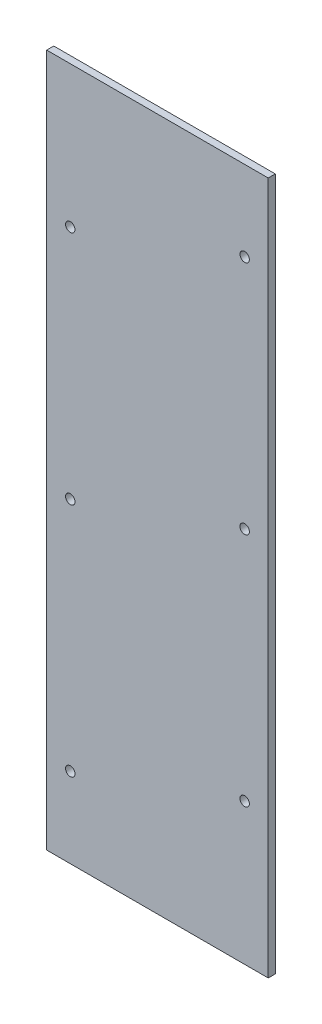
ISO-10303-21;
HEADER;
FILE_DESCRIPTION(('STEP AP214'),'2;1');
FILE_NAME('part.step','',(''),(''),'','','');
FILE_SCHEMA(('AUTOMOTIVE_DESIGN { 1 0 10303 214 1 1 1 1 }'));
ENDSEC;
DATA;
#1=APPLICATION_CONTEXT('core data for automotive mechanical design processes');
#2=APPLICATION_PROTOCOL_DEFINITION('international standard','automotive_design',2000,#1);
#3=PRODUCT_CONTEXT('',#1,'mechanical');
#4=PRODUCT('Part','Part','',(#3));
#5=PRODUCT_RELATED_PRODUCT_CATEGORY('part','',(#4));
#6=PRODUCT_DEFINITION_FORMATION('','',#4);
#7=PRODUCT_DEFINITION_CONTEXT('part definition',#1,'design');
#8=PRODUCT_DEFINITION('design','',#6,#7);
#9=PRODUCT_DEFINITION_SHAPE('','',#8);
#10=(LENGTH_UNIT() NAMED_UNIT(*) SI_UNIT(.MILLI.,.METRE.));
#11=(NAMED_UNIT(*) PLANE_ANGLE_UNIT() SI_UNIT($,.RADIAN.));
#12=(NAMED_UNIT(*) SI_UNIT($,.STERADIAN.) SOLID_ANGLE_UNIT());
#13=UNCERTAINTY_MEASURE_WITH_UNIT(LENGTH_MEASURE(1.E-05),#10,'distance_accuracy_value','');
#14=(GEOMETRIC_REPRESENTATION_CONTEXT(3) GLOBAL_UNCERTAINTY_ASSIGNED_CONTEXT((#13)) GLOBAL_UNIT_ASSIGNED_CONTEXT((#10,
#11,#12)) REPRESENTATION_CONTEXT('',''));
#15=CARTESIAN_POINT('',(0.,0.,0.));
#16=DIRECTION('',(0.,0.,1.));
#17=DIRECTION('',(1.,0.,0.));
#18=AXIS2_PLACEMENT_3D('',#15,#16,#17);
#19=CARTESIAN_POINT('',(47.,-147.,3.));
#20=DIRECTION('',(-1.,0.,0.));
#21=DIRECTION('',(0.,0.,1.));
#22=AXIS2_PLACEMENT_3D('',#19,#20,#21);
#23=PLANE('',#22);
#24=DIRECTION('',(0.,1.,0.));
#25=VECTOR('',#24,1.);
#26=CARTESIAN_POINT('',(47.,-147.,0.));
#27=LINE('',#26,#25);
#28=CARTESIAN_POINT('',(47.,-147.,0.));
#29=VERTEX_POINT('',#28);
#30=CARTESIAN_POINT('',(47.,147.,0.));
#31=VERTEX_POINT('',#30);
#32=EDGE_CURVE('E106',#29,#31,#27,.T.);
#33=ORIENTED_EDGE('',*,*,#32,.T.);
#34=DIRECTION('',(0.,0.,-1.));
#35=VECTOR('',#34,1.);
#36=CARTESIAN_POINT('',(47.,147.,3.));
#37=LINE('',#36,#35);
#38=CARTESIAN_POINT('',(47.,147.,3.));
#39=VERTEX_POINT('',#38);
#40=EDGE_CURVE('E11',#39,#31,#37,.T.);
#41=ORIENTED_EDGE('',*,*,#40,.F.);
#42=DIRECTION('',(0.,1.,0.));
#43=VECTOR('',#42,1.);
#44=CARTESIAN_POINT('',(47.,-147.,3.));
#45=LINE('',#44,#43);
#46=CARTESIAN_POINT('',(47.,-147.,3.));
#47=VERTEX_POINT('',#46);
#48=EDGE_CURVE('E90',#47,#39,#45,.T.);
#49=ORIENTED_EDGE('',*,*,#48,.F.);
#50=DIRECTION('',(0.,0.,-1.));
#51=VECTOR('',#50,1.);
#52=CARTESIAN_POINT('',(47.,-147.,3.));
#53=LINE('',#52,#51);
#54=EDGE_CURVE('E102',#47,#29,#53,.T.);
#55=ORIENTED_EDGE('',*,*,#54,.T.);
#56=EDGE_LOOP('',(#33,#41,#49,#55));
#57=FACE_BOUND('',#56,.T.);
#58=ADVANCED_FACE('F38',(#57),#23,.F.);
#59=CARTESIAN_POINT('',(-47.,147.,3.));
#60=DIRECTION('',(0.,-1.,0.));
#61=DIRECTION('',(0.,0.,-1.));
#62=AXIS2_PLACEMENT_3D('',#59,#60,#61);
#63=PLANE('',#62);
#64=DIRECTION('',(-1.,0.,0.));
#65=VECTOR('',#64,1.);
#66=CARTESIAN_POINT('',(-47.,147.,0.));
#67=LINE('',#66,#65);
#68=CARTESIAN_POINT('',(-47.,147.,0.));
#69=VERTEX_POINT('',#68);
#70=EDGE_CURVE('E95',#31,#69,#67,.T.);
#71=ORIENTED_EDGE('',*,*,#70,.T.);
#72=DIRECTION('',(0.,0.,-1.));
#73=VECTOR('',#72,1.);
#74=CARTESIAN_POINT('',(-47.,147.,3.));
#75=LINE('',#74,#73);
#76=CARTESIAN_POINT('',(-47.,147.,3.));
#77=VERTEX_POINT('',#76);
#78=EDGE_CURVE('E47',#77,#69,#75,.T.);
#79=ORIENTED_EDGE('',*,*,#78,.F.);
#80=DIRECTION('',(-1.,0.,0.));
#81=VECTOR('',#80,1.);
#82=CARTESIAN_POINT('',(-47.,147.,3.));
#83=LINE('',#82,#81);
#84=EDGE_CURVE('E85',#39,#77,#83,.T.);
#85=ORIENTED_EDGE('',*,*,#84,.F.);
#86=ORIENTED_EDGE('',*,*,#40,.T.);
#87=EDGE_LOOP('',(#71,#79,#85,#86));
#88=FACE_BOUND('',#87,.T.);
#89=ADVANCED_FACE('F94',(#88),#63,.F.);
#90=CARTESIAN_POINT('',(-47.,-147.,3.));
#91=DIRECTION('',(1.,0.,0.));
#92=DIRECTION('',(0.,0.,-1.));
#93=AXIS2_PLACEMENT_3D('',#90,#91,#92);
#94=PLANE('',#93);
#95=DIRECTION('',(0.,-1.,0.));
#96=VECTOR('',#95,1.);
#97=CARTESIAN_POINT('',(-47.,-147.,0.));
#98=LINE('',#97,#96);
#99=CARTESIAN_POINT('',(-47.,-147.,0.));
#100=VERTEX_POINT('',#99);
#101=EDGE_CURVE('E72',#69,#100,#98,.T.);
#102=ORIENTED_EDGE('',*,*,#101,.T.);
#103=DIRECTION('',(0.,0.,-1.));
#104=VECTOR('',#103,1.);
#105=CARTESIAN_POINT('',(-47.,-147.,3.));
#106=LINE('',#105,#104);
#107=CARTESIAN_POINT('',(-47.,-147.,3.));
#108=VERTEX_POINT('',#107);
#109=EDGE_CURVE('E97',#108,#100,#106,.T.);
#110=ORIENTED_EDGE('',*,*,#109,.F.);
#111=DIRECTION('',(0.,-1.,0.));
#112=VECTOR('',#111,1.);
#113=CARTESIAN_POINT('',(-47.,-147.,3.));
#114=LINE('',#113,#112);
#115=EDGE_CURVE('E88',#77,#108,#114,.T.);
#116=ORIENTED_EDGE('',*,*,#115,.F.);
#117=ORIENTED_EDGE('',*,*,#78,.T.);
#118=EDGE_LOOP('',(#102,#110,#116,#117));
#119=FACE_BOUND('',#118,.T.);
#120=ADVANCED_FACE('F98',(#119),#94,.F.);
#121=CARTESIAN_POINT('',(-47.,-147.,3.));
#122=DIRECTION('',(0.,1.,0.));
#123=DIRECTION('',(0.,0.,1.));
#124=AXIS2_PLACEMENT_3D('',#121,#122,#123);
#125=PLANE('',#124);
#126=DIRECTION('',(1.,0.,0.));
#127=VECTOR('',#126,1.);
#128=CARTESIAN_POINT('',(-47.,-147.,0.));
#129=LINE('',#128,#127);
#130=EDGE_CURVE('E78',#100,#29,#129,.T.);
#131=ORIENTED_EDGE('',*,*,#130,.T.);
#132=ORIENTED_EDGE('',*,*,#54,.F.);
#133=DIRECTION('',(1.,0.,0.));
#134=VECTOR('',#133,1.);
#135=CARTESIAN_POINT('',(-47.,-147.,3.));
#136=LINE('',#135,#134);
#137=EDGE_CURVE('E55',#108,#47,#136,.T.);
#138=ORIENTED_EDGE('',*,*,#137,.F.);
#139=ORIENTED_EDGE('',*,*,#109,.T.);
#140=EDGE_LOOP('',(#131,#132,#138,#139));
#141=FACE_BOUND('',#140,.T.);
#142=ADVANCED_FACE('F120',(#141),#125,.F.);
#143=CARTESIAN_POINT('',(0.,0.,3.));
#144=DIRECTION('',(0.,0.,-1.));
#145=DIRECTION('',(-1.,0.,0.));
#146=AXIS2_PLACEMENT_3D('',#143,#144,#145);
#147=PLANE('',#146);
#148=CARTESIAN_POINT('',(-37.,-113.,3.));
#149=DIRECTION('',(0.,0.,1.));
#150=DIRECTION('',(1.,0.,0.));
#151=AXIS2_PLACEMENT_3D('',#148,#149,#150);
#152=CIRCLE('',#151,2.);
#153=CARTESIAN_POINT('',(-35.,-113.,3.));
#154=VERTEX_POINT('',#153);
#155=EDGE_CURVE('E167',#154,#154,#152,.T.);
#156=ORIENTED_EDGE('',*,*,#155,.F.);
#157=EDGE_LOOP('',(#156));
#158=FACE_BOUND('',#157,.T.);
#159=CARTESIAN_POINT('',(37.,-87.,3.));
#160=DIRECTION('',(0.,0.,1.));
#161=DIRECTION('',(1.,0.,0.));
#162=AXIS2_PLACEMENT_3D('',#159,#160,#161);
#163=CIRCLE('',#162,2.);
#164=CARTESIAN_POINT('',(39.,-87.,3.));
#165=VERTEX_POINT('',#164);
#166=EDGE_CURVE('E163',#165,#165,#163,.T.);
#167=ORIENTED_EDGE('',*,*,#166,.F.);
#168=EDGE_LOOP('',(#167));
#169=FACE_BOUND('',#168,.T.);
#170=CARTESIAN_POINT('',(37.,13.,3.));
#171=DIRECTION('',(0.,0.,1.));
#172=DIRECTION('',(1.,0.,0.));
#173=AXIS2_PLACEMENT_3D('',#170,#171,#172);
#174=CIRCLE('',#173,2.);
#175=CARTESIAN_POINT('',(39.,13.,3.));
#176=VERTEX_POINT('',#175);
#177=EDGE_CURVE('E155',#176,#176,#174,.T.);
#178=ORIENTED_EDGE('',*,*,#177,.F.);
#179=EDGE_LOOP('',(#178));
#180=FACE_BOUND('',#179,.T.);
#181=CARTESIAN_POINT('',(-37.,-13.,3.));
#182=DIRECTION('',(0.,0.,1.));
#183=DIRECTION('',(1.,0.,0.));
#184=AXIS2_PLACEMENT_3D('',#181,#182,#183);
#185=CIRCLE('',#184,2.);
#186=CARTESIAN_POINT('',(-35.,-13.,3.));
#187=VERTEX_POINT('',#186);
#188=EDGE_CURVE('E147',#187,#187,#185,.T.);
#189=ORIENTED_EDGE('',*,*,#188,.F.);
#190=EDGE_LOOP('',(#189));
#191=FACE_BOUND('',#190,.T.);
#192=CARTESIAN_POINT('',(-37.,87.,3.));
#193=DIRECTION('',(0.,0.,1.));
#194=DIRECTION('',(1.,0.,0.));
#195=AXIS2_PLACEMENT_3D('',#192,#193,#194);
#196=CIRCLE('',#195,2.);
#197=CARTESIAN_POINT('',(-35.,87.,3.));
#198=VERTEX_POINT('',#197);
#199=EDGE_CURVE('E139',#198,#198,#196,.T.);
#200=ORIENTED_EDGE('',*,*,#199,.F.);
#201=EDGE_LOOP('',(#200));
#202=FACE_BOUND('',#201,.T.);
#203=CARTESIAN_POINT('',(37.,113.,3.));
#204=DIRECTION('',(0.,0.,1.));
#205=DIRECTION('',(1.,0.,0.));
#206=AXIS2_PLACEMENT_3D('',#203,#204,#205);
#207=CIRCLE('',#206,2.);
#208=CARTESIAN_POINT('',(39.,113.,3.));
#209=VERTEX_POINT('',#208);
#210=EDGE_CURVE('E131',#209,#209,#207,.T.);
#211=ORIENTED_EDGE('',*,*,#210,.F.);
#212=EDGE_LOOP('',(#211));
#213=FACE_BOUND('',#212,.T.);
#214=ORIENTED_EDGE('',*,*,#48,.T.);
#215=ORIENTED_EDGE('',*,*,#84,.T.);
#216=ORIENTED_EDGE('',*,*,#115,.T.);
#217=ORIENTED_EDGE('',*,*,#137,.T.);
#218=EDGE_LOOP('',(#214,#215,#216,#217));
#219=FACE_BOUND('',#218,.T.);
#220=ADVANCED_FACE('F86',(#158,#169,#180,#191,#202,#213,#219),#147,.F.);
#221=CARTESIAN_POINT('',(0.,0.,0.));
#222=DIRECTION('',(0.,0.,-1.));
#223=DIRECTION('',(-1.,0.,0.));
#224=AXIS2_PLACEMENT_3D('',#221,#222,#223);
#225=PLANE('',#224);
#226=CARTESIAN_POINT('',(-37.,-113.,0.));
#227=DIRECTION('',(0.,0.,1.));
#228=DIRECTION('',(1.,0.,0.));
#229=AXIS2_PLACEMENT_3D('',#226,#227,#228);
#230=CIRCLE('',#229,2.);
#231=CARTESIAN_POINT('',(-35.,-113.,0.));
#232=VERTEX_POINT('',#231);
#233=EDGE_CURVE('E110',#232,#232,#230,.T.);
#234=ORIENTED_EDGE('',*,*,#233,.T.);
#235=EDGE_LOOP('',(#234));
#236=FACE_BOUND('',#235,.T.);
#237=CARTESIAN_POINT('',(37.,-87.,0.));
#238=DIRECTION('',(0.,0.,1.));
#239=DIRECTION('',(1.,0.,0.));
#240=AXIS2_PLACEMENT_3D('',#237,#238,#239);
#241=CIRCLE('',#240,2.);
#242=CARTESIAN_POINT('',(39.,-87.,0.));
#243=VERTEX_POINT('',#242);
#244=EDGE_CURVE('E159',#243,#243,#241,.T.);
#245=ORIENTED_EDGE('',*,*,#244,.T.);
#246=EDGE_LOOP('',(#245));
#247=FACE_BOUND('',#246,.T.);
#248=CARTESIAN_POINT('',(37.,13.,0.));
#249=DIRECTION('',(0.,0.,1.));
#250=DIRECTION('',(1.,0.,0.));
#251=AXIS2_PLACEMENT_3D('',#248,#249,#250);
#252=CIRCLE('',#251,2.);
#253=CARTESIAN_POINT('',(39.,13.,0.));
#254=VERTEX_POINT('',#253);
#255=EDGE_CURVE('E151',#254,#254,#252,.T.);
#256=ORIENTED_EDGE('',*,*,#255,.T.);
#257=EDGE_LOOP('',(#256));
#258=FACE_BOUND('',#257,.T.);
#259=CARTESIAN_POINT('',(-37.,-13.,0.));
#260=DIRECTION('',(0.,0.,1.));
#261=DIRECTION('',(1.,0.,0.));
#262=AXIS2_PLACEMENT_3D('',#259,#260,#261);
#263=CIRCLE('',#262,2.);
#264=CARTESIAN_POINT('',(-35.,-13.,0.));
#265=VERTEX_POINT('',#264);
#266=EDGE_CURVE('E143',#265,#265,#263,.T.);
#267=ORIENTED_EDGE('',*,*,#266,.T.);
#268=EDGE_LOOP('',(#267));
#269=FACE_BOUND('',#268,.T.);
#270=CARTESIAN_POINT('',(-37.,87.,0.));
#271=DIRECTION('',(0.,0.,1.));
#272=DIRECTION('',(1.,0.,0.));
#273=AXIS2_PLACEMENT_3D('',#270,#271,#272);
#274=CIRCLE('',#273,2.);
#275=CARTESIAN_POINT('',(-35.,87.,0.));
#276=VERTEX_POINT('',#275);
#277=EDGE_CURVE('E135',#276,#276,#274,.T.);
#278=ORIENTED_EDGE('',*,*,#277,.T.);
#279=EDGE_LOOP('',(#278));
#280=FACE_BOUND('',#279,.T.);
#281=CARTESIAN_POINT('',(37.,113.,0.));
#282=DIRECTION('',(0.,0.,1.));
#283=DIRECTION('',(1.,0.,0.));
#284=AXIS2_PLACEMENT_3D('',#281,#282,#283);
#285=CIRCLE('',#284,2.);
#286=CARTESIAN_POINT('',(39.,113.,0.));
#287=VERTEX_POINT('',#286);
#288=EDGE_CURVE('E127',#287,#287,#285,.T.);
#289=ORIENTED_EDGE('',*,*,#288,.T.);
#290=EDGE_LOOP('',(#289));
#291=FACE_BOUND('',#290,.T.);
#292=ORIENTED_EDGE('',*,*,#32,.F.);
#293=ORIENTED_EDGE('',*,*,#130,.F.);
#294=ORIENTED_EDGE('',*,*,#101,.F.);
#295=ORIENTED_EDGE('',*,*,#70,.F.);
#296=EDGE_LOOP('',(#292,#293,#294,#295));
#297=FACE_BOUND('',#296,.T.);
#298=ADVANCED_FACE('F123',(#236,#247,#258,#269,#280,#291,#297),#225,.T.);
#299=CARTESIAN_POINT('',(37.,113.,0.));
#300=DIRECTION('',(0.,0.,1.));
#301=DIRECTION('',(1.,0.,0.));
#302=AXIS2_PLACEMENT_3D('',#299,#300,#301);
#303=CYLINDRICAL_SURFACE('',#302,2.);
#304=ORIENTED_EDGE('',*,*,#288,.F.);
#305=EDGE_LOOP('',(#304));
#306=FACE_BOUND('',#305,.T.);
#307=ORIENTED_EDGE('',*,*,#210,.T.);
#308=EDGE_LOOP('',(#307));
#309=FACE_BOUND('',#308,.T.);
#310=ADVANCED_FACE('F197',(#306,#309),#303,.F.);
#311=CARTESIAN_POINT('',(-37.,87.,0.));
#312=DIRECTION('',(0.,0.,1.));
#313=DIRECTION('',(1.,0.,0.));
#314=AXIS2_PLACEMENT_3D('',#311,#312,#313);
#315=CYLINDRICAL_SURFACE('',#314,2.);
#316=ORIENTED_EDGE('',*,*,#277,.F.);
#317=EDGE_LOOP('',(#316));
#318=FACE_BOUND('',#317,.T.);
#319=ORIENTED_EDGE('',*,*,#199,.T.);
#320=EDGE_LOOP('',(#319));
#321=FACE_BOUND('',#320,.T.);
#322=ADVANCED_FACE('F199',(#318,#321),#315,.F.);
#323=CARTESIAN_POINT('',(-37.,-13.,0.));
#324=DIRECTION('',(0.,0.,1.));
#325=DIRECTION('',(1.,0.,0.));
#326=AXIS2_PLACEMENT_3D('',#323,#324,#325);
#327=CYLINDRICAL_SURFACE('',#326,2.);
#328=ORIENTED_EDGE('',*,*,#266,.F.);
#329=EDGE_LOOP('',(#328));
#330=FACE_BOUND('',#329,.T.);
#331=ORIENTED_EDGE('',*,*,#188,.T.);
#332=EDGE_LOOP('',(#331));
#333=FACE_BOUND('',#332,.T.);
#334=ADVANCED_FACE('F206',(#330,#333),#327,.F.);
#335=CARTESIAN_POINT('',(37.,13.,0.));
#336=DIRECTION('',(0.,0.,1.));
#337=DIRECTION('',(1.,0.,0.));
#338=AXIS2_PLACEMENT_3D('',#335,#336,#337);
#339=CYLINDRICAL_SURFACE('',#338,2.);
#340=ORIENTED_EDGE('',*,*,#255,.F.);
#341=EDGE_LOOP('',(#340));
#342=FACE_BOUND('',#341,.T.);
#343=ORIENTED_EDGE('',*,*,#177,.T.);
#344=EDGE_LOOP('',(#343));
#345=FACE_BOUND('',#344,.T.);
#346=ADVANCED_FACE('F254',(#342,#345),#339,.F.);
#347=CARTESIAN_POINT('',(37.,-87.,0.));
#348=DIRECTION('',(0.,0.,1.));
#349=DIRECTION('',(1.,0.,0.));
#350=AXIS2_PLACEMENT_3D('',#347,#348,#349);
#351=CYLINDRICAL_SURFACE('',#350,2.);
#352=ORIENTED_EDGE('',*,*,#244,.F.);
#353=EDGE_LOOP('',(#352));
#354=FACE_BOUND('',#353,.T.);
#355=ORIENTED_EDGE('',*,*,#166,.T.);
#356=EDGE_LOOP('',(#355));
#357=FACE_BOUND('',#356,.T.);
#358=ADVANCED_FACE('F180',(#354,#357),#351,.F.);
#359=CARTESIAN_POINT('',(-37.,-113.,0.));
#360=DIRECTION('',(0.,0.,1.));
#361=DIRECTION('',(1.,0.,0.));
#362=AXIS2_PLACEMENT_3D('',#359,#360,#361);
#363=CYLINDRICAL_SURFACE('',#362,2.);
#364=ORIENTED_EDGE('',*,*,#233,.F.);
#365=EDGE_LOOP('',(#364));
#366=FACE_BOUND('',#365,.T.);
#367=ORIENTED_EDGE('',*,*,#155,.T.);
#368=EDGE_LOOP('',(#367));
#369=FACE_BOUND('',#368,.T.);
#370=ADVANCED_FACE('F177',(#366,#369),#363,.F.);
#371=CLOSED_SHELL('',(#58,#89,#120,#142,#220,#298,#310,#322,#334,#346,#358,#370));
#372=MANIFOLD_SOLID_BREP('B2',#371);
#373=ADVANCED_BREP_SHAPE_REPRESENTATION('',(#18,#372),#14);
#374=SHAPE_DEFINITION_REPRESENTATION(#9,#373);
ENDSEC;
END-ISO-10303-21;
